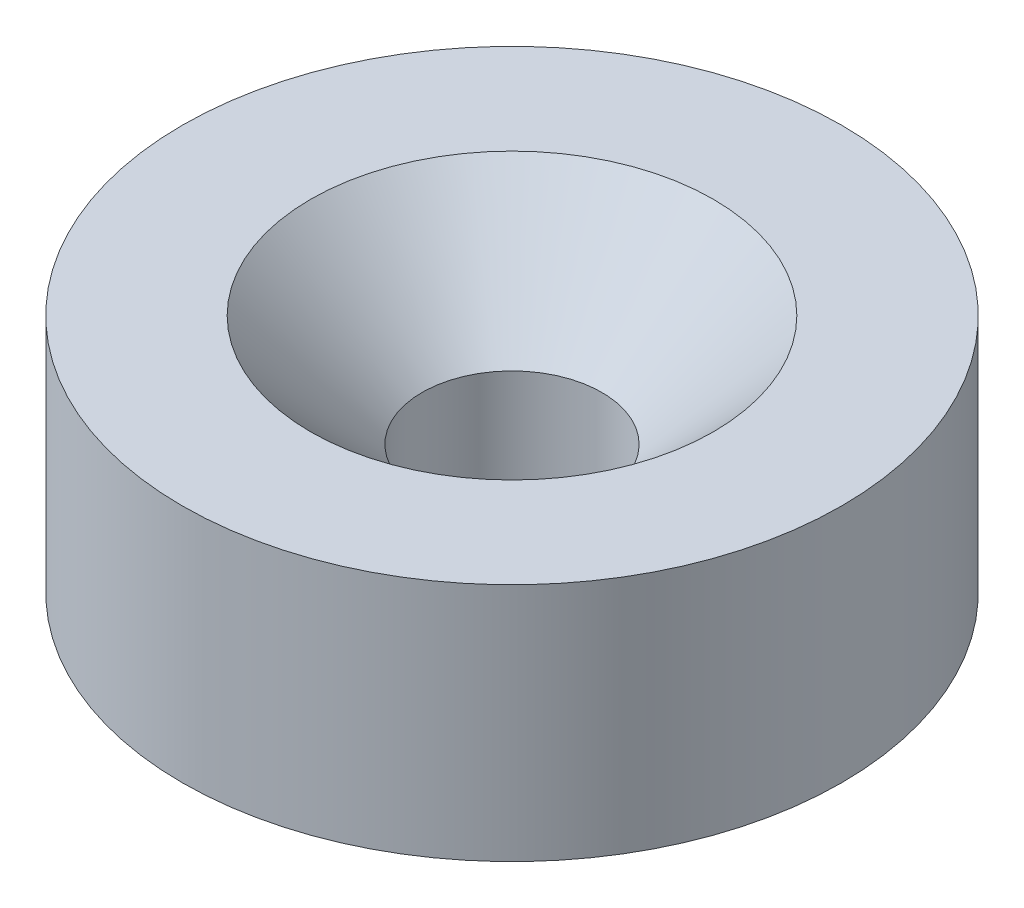
ISO-10303-21;
HEADER;
FILE_DESCRIPTION(('STEP AP214'),'2;1');
FILE_NAME('part.step','',(''),(''),'','','');
FILE_SCHEMA(('AUTOMOTIVE_DESIGN { 1 0 10303 214 1 1 1 1 }'));
ENDSEC;
DATA;
#1=APPLICATION_CONTEXT('core data for automotive mechanical design processes');
#2=APPLICATION_PROTOCOL_DEFINITION('international standard','automotive_design',2000,#1);
#3=PRODUCT_CONTEXT('',#1,'mechanical');
#4=PRODUCT('Part','Part','',(#3));
#5=PRODUCT_RELATED_PRODUCT_CATEGORY('part','',(#4));
#6=PRODUCT_DEFINITION_FORMATION('','',#4);
#7=PRODUCT_DEFINITION_CONTEXT('part definition',#1,'design');
#8=PRODUCT_DEFINITION('design','',#6,#7);
#9=PRODUCT_DEFINITION_SHAPE('','',#8);
#10=(LENGTH_UNIT() NAMED_UNIT(*) SI_UNIT(.MILLI.,.METRE.));
#11=(NAMED_UNIT(*) PLANE_ANGLE_UNIT() SI_UNIT($,.RADIAN.));
#12=(NAMED_UNIT(*) SI_UNIT($,.STERADIAN.) SOLID_ANGLE_UNIT());
#13=UNCERTAINTY_MEASURE_WITH_UNIT(LENGTH_MEASURE(1.E-05),#10,'distance_accuracy_value','');
#14=(GEOMETRIC_REPRESENTATION_CONTEXT(3) GLOBAL_UNCERTAINTY_ASSIGNED_CONTEXT((#13)) GLOBAL_UNIT_ASSIGNED_CONTEXT((#10,
#11,#12)) REPRESENTATION_CONTEXT('',''));
#15=CARTESIAN_POINT('',(0.,0.,0.));
#16=DIRECTION('',(0.,0.,1.));
#17=DIRECTION('',(1.,0.,0.));
#18=AXIS2_PLACEMENT_3D('',#15,#16,#17);
#19=CARTESIAN_POINT('',(0.,4.,0.));
#20=DIRECTION('',(0.,-1.,0.));
#21=DIRECTION('',(0.,0.,-1.));
#22=AXIS2_PLACEMENT_3D('',#19,#20,#21);
#23=CYLINDRICAL_SURFACE('',#22,5.5);
#24=CARTESIAN_POINT('',(0.,4.,0.));
#25=DIRECTION('',(0.,1.,0.));
#26=DIRECTION('',(0.,0.,1.));
#27=AXIS2_PLACEMENT_3D('',#24,#25,#26);
#28=CIRCLE('',#27,5.5);
#29=CARTESIAN_POINT('',(0.,4.,5.5));
#30=VERTEX_POINT('',#29);
#31=EDGE_CURVE('E10',#30,#30,#28,.T.);
#32=ORIENTED_EDGE('',*,*,#31,.F.);
#33=EDGE_LOOP('',(#32));
#34=FACE_BOUND('',#33,.T.);
#35=CARTESIAN_POINT('',(0.,0.,0.));
#36=DIRECTION('',(0.,1.,0.));
#37=DIRECTION('',(0.,0.,1.));
#38=AXIS2_PLACEMENT_3D('',#35,#36,#37);
#39=CIRCLE('',#38,5.5);
#40=CARTESIAN_POINT('',(0.,0.,5.5));
#41=VERTEX_POINT('',#40);
#42=EDGE_CURVE('E44',#41,#41,#39,.T.);
#43=ORIENTED_EDGE('',*,*,#42,.T.);
#44=EDGE_LOOP('',(#43));
#45=FACE_BOUND('',#44,.T.);
#46=ADVANCED_FACE('F37',(#34,#45),#23,.T.);
#47=CARTESIAN_POINT('',(0.,4.,0.));
#48=DIRECTION('',(0.,1.,0.));
#49=DIRECTION('',(0.,0.,1.));
#50=AXIS2_PLACEMENT_3D('',#47,#48,#49);
#51=PLANE('',#50);
#52=CARTESIAN_POINT('',(0.,4.,0.));
#53=DIRECTION('',(0.,1.,0.));
#54=DIRECTION('',(0.,0.,1.));
#55=AXIS2_PLACEMENT_3D('',#52,#53,#54);
#56=CIRCLE('',#55,3.36);
#57=CARTESIAN_POINT('',(0.,4.,3.36));
#58=VERTEX_POINT('',#57);
#59=EDGE_CURVE('E53',#58,#58,#56,.T.);
#60=ORIENTED_EDGE('',*,*,#59,.F.);
#61=EDGE_LOOP('',(#60));
#62=FACE_BOUND('',#61,.T.);
#63=ORIENTED_EDGE('',*,*,#31,.T.);
#64=EDGE_LOOP('',(#63));
#65=FACE_BOUND('',#64,.T.);
#66=ADVANCED_FACE('F59',(#62,#65),#51,.T.);
#67=CARTESIAN_POINT('',(0.,0.,0.));
#68=DIRECTION('',(0.,1.,0.));
#69=DIRECTION('',(0.,0.,1.));
#70=AXIS2_PLACEMENT_3D('',#67,#68,#69);
#71=PLANE('',#70);
#72=CARTESIAN_POINT('',(0.,0.,0.));
#73=DIRECTION('',(0.,1.,0.));
#74=DIRECTION('',(0.,0.,1.));
#75=AXIS2_PLACEMENT_3D('',#72,#73,#74);
#76=CIRCLE('',#75,1.49999999999999);
#77=CARTESIAN_POINT('',(0.,0.,1.49999999999999));
#78=VERTEX_POINT('',#77);
#79=EDGE_CURVE('E40',#78,#78,#76,.T.);
#80=ORIENTED_EDGE('',*,*,#79,.T.);
#81=EDGE_LOOP('',(#80));
#82=FACE_BOUND('',#81,.T.);
#83=ORIENTED_EDGE('',*,*,#42,.F.);
#84=EDGE_LOOP('',(#83));
#85=FACE_BOUND('',#84,.T.);
#86=ADVANCED_FACE('F61',(#82,#85),#71,.F.);
#87=CARTESIAN_POINT('',(0.,4.,0.));
#88=DIRECTION('',(0.,1.,0.));
#89=DIRECTION('',(0.,0.,1.));
#90=AXIS2_PLACEMENT_3D('',#87,#88,#89);
#91=CYLINDRICAL_SURFACE('',#90,1.49999999999999);
#92=CARTESIAN_POINT('',(0.,2.14,0.));
#93=DIRECTION('',(0.,1.,0.));
#94=DIRECTION('',(0.,0.,1.));
#95=AXIS2_PLACEMENT_3D('',#92,#93,#94);
#96=CIRCLE('',#95,1.5);
#97=CARTESIAN_POINT('',(0.,2.14,1.5));
#98=VERTEX_POINT('',#97);
#99=EDGE_CURVE('E50',#98,#98,#96,.T.);
#100=ORIENTED_EDGE('',*,*,#99,.T.);
#101=EDGE_LOOP('',(#100));
#102=FACE_BOUND('',#101,.T.);
#103=ORIENTED_EDGE('',*,*,#79,.F.);
#104=EDGE_LOOP('',(#103));
#105=FACE_BOUND('',#104,.T.);
#106=ADVANCED_FACE('F67',(#102,#105),#91,.F.);
#107=CARTESIAN_POINT('',(0.,4.,0.));
#108=DIRECTION('',(0.,1.,0.));
#109=DIRECTION('',(0.,0.,1.));
#110=AXIS2_PLACEMENT_3D('',#107,#108,#109);
#111=CONICAL_SURFACE('',#110,3.36,0.785398163397449);
#112=ORIENTED_EDGE('',*,*,#99,.F.);
#113=EDGE_LOOP('',(#112));
#114=FACE_BOUND('',#113,.T.);
#115=ORIENTED_EDGE('',*,*,#59,.T.);
#116=EDGE_LOOP('',(#115));
#117=FACE_BOUND('',#116,.T.);
#118=ADVANCED_FACE('F57',(#114,#117),#111,.F.);
#119=CLOSED_SHELL('',(#46,#66,#86,#106,#118));
#120=MANIFOLD_SOLID_BREP('B2',#119);
#121=ADVANCED_BREP_SHAPE_REPRESENTATION('',(#18,#120),#14);
#122=SHAPE_DEFINITION_REPRESENTATION(#9,#121);
ENDSEC;
END-ISO-10303-21;
